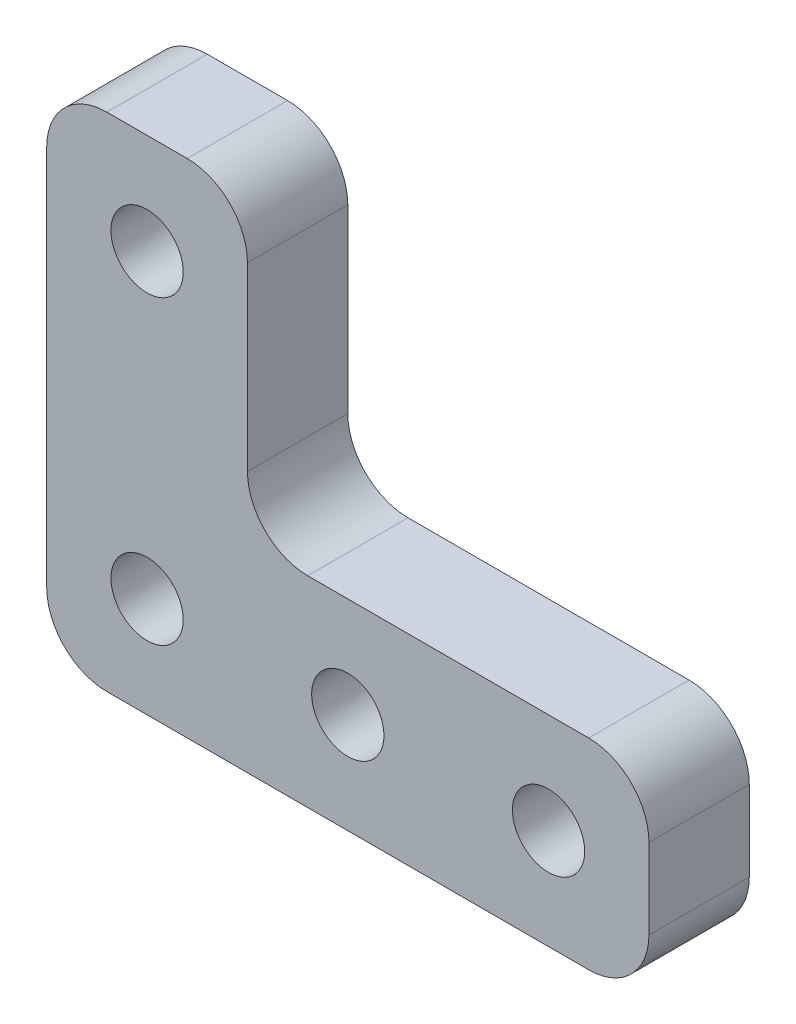
ISO-10303-21;
HEADER;
FILE_DESCRIPTION(('STEP AP214'),'2;1');
FILE_NAME('part.step','',(''),(''),'','','');
FILE_SCHEMA(('AUTOMOTIVE_DESIGN { 1 0 10303 214 1 1 1 1 }'));
ENDSEC;
DATA;
#1=APPLICATION_CONTEXT('core data for automotive mechanical design processes');
#2=APPLICATION_PROTOCOL_DEFINITION('international standard','automotive_design',2000,#1);
#3=PRODUCT_CONTEXT('',#1,'mechanical');
#4=PRODUCT('Part','Part','',(#3));
#5=PRODUCT_RELATED_PRODUCT_CATEGORY('part','',(#4));
#6=PRODUCT_DEFINITION_FORMATION('','',#4);
#7=PRODUCT_DEFINITION_CONTEXT('part definition',#1,'design');
#8=PRODUCT_DEFINITION('design','',#6,#7);
#9=PRODUCT_DEFINITION_SHAPE('','',#8);
#10=(LENGTH_UNIT() NAMED_UNIT(*) SI_UNIT(.MILLI.,.METRE.));
#11=(NAMED_UNIT(*) PLANE_ANGLE_UNIT() SI_UNIT($,.RADIAN.));
#12=(NAMED_UNIT(*) SI_UNIT($,.STERADIAN.) SOLID_ANGLE_UNIT());
#13=UNCERTAINTY_MEASURE_WITH_UNIT(LENGTH_MEASURE(1.E-05),#10,'distance_accuracy_value','');
#14=(GEOMETRIC_REPRESENTATION_CONTEXT(3) GLOBAL_UNCERTAINTY_ASSIGNED_CONTEXT((#13)) GLOBAL_UNIT_ASSIGNED_CONTEXT((#10,
#11,#12)) REPRESENTATION_CONTEXT('',''));
#15=CARTESIAN_POINT('',(0.,0.,0.));
#16=DIRECTION('',(0.,0.,1.));
#17=DIRECTION('',(1.,0.,0.));
#18=AXIS2_PLACEMENT_3D('',#15,#16,#17);
#19=CARTESIAN_POINT('',(0.,0.,6.35));
#20=DIRECTION('',(0.,0.,-1.));
#21=DIRECTION('',(-1.,0.,0.));
#22=AXIS2_PLACEMENT_3D('',#19,#20,#21);
#23=PLANE('',#22);
#24=DIRECTION('',(0.,1.,0.));
#25=VECTOR('',#24,1.);
#26=CARTESIAN_POINT('',(31.75,6.35,6.35));
#27=LINE('',#26,#25);
#28=CARTESIAN_POINT('',(31.75,-2.54,6.35));
#29=VERTEX_POINT('',#28);
#30=CARTESIAN_POINT('',(31.75,2.54,6.35));
#31=VERTEX_POINT('',#30);
#32=EDGE_CURVE('E228',#29,#31,#27,.T.);
#33=ORIENTED_EDGE('',*,*,#32,.T.);
#34=CARTESIAN_POINT('',(27.94,2.54,6.35));
#35=DIRECTION('',(0.,0.,-1.));
#36=DIRECTION('',(-1.,0.,0.));
#37=AXIS2_PLACEMENT_3D('',#34,#35,#36);
#38=CIRCLE('',#37,3.81);
#39=CARTESIAN_POINT('',(27.94,6.35,6.35));
#40=VERTEX_POINT('',#39);
#41=EDGE_CURVE('E200',#31,#40,#38,.F.);
#42=ORIENTED_EDGE('',*,*,#41,.T.);
#43=DIRECTION('',(-1.,0.,0.));
#44=VECTOR('',#43,1.);
#45=CARTESIAN_POINT('',(6.35,6.35,6.35));
#46=LINE('',#45,#44);
#47=CARTESIAN_POINT('',(10.16,6.35,6.35));
#48=VERTEX_POINT('',#47);
#49=EDGE_CURVE('E156',#40,#48,#46,.T.);
#50=ORIENTED_EDGE('',*,*,#49,.T.);
#51=CARTESIAN_POINT('',(10.16,10.16,6.35));
#52=DIRECTION('',(0.,0.,-1.));
#53=DIRECTION('',(-1.,0.,0.));
#54=AXIS2_PLACEMENT_3D('',#51,#52,#53);
#55=CIRCLE('',#54,3.81);
#56=CARTESIAN_POINT('',(6.35,10.16,6.35));
#57=VERTEX_POINT('',#56);
#58=EDGE_CURVE('E11',#48,#57,#55,.T.);
#59=ORIENTED_EDGE('',*,*,#58,.T.);
#60=DIRECTION('',(0.,1.,0.));
#61=VECTOR('',#60,1.);
#62=CARTESIAN_POINT('',(6.35,25.4,6.35));
#63=LINE('',#62,#61);
#64=CARTESIAN_POINT('',(6.35,21.59,6.35));
#65=VERTEX_POINT('',#64);
#66=EDGE_CURVE('E227',#57,#65,#63,.T.);
#67=ORIENTED_EDGE('',*,*,#66,.T.);
#68=CARTESIAN_POINT('',(2.54,21.59,6.35));
#69=DIRECTION('',(0.,0.,-1.));
#70=DIRECTION('',(-1.,0.,0.));
#71=AXIS2_PLACEMENT_3D('',#68,#69,#70);
#72=CIRCLE('',#71,3.81);
#73=CARTESIAN_POINT('',(2.54,25.4,6.35));
#74=VERTEX_POINT('',#73);
#75=EDGE_CURVE('E193',#65,#74,#72,.F.);
#76=ORIENTED_EDGE('',*,*,#75,.T.);
#77=DIRECTION('',(-1.,0.,0.));
#78=VECTOR('',#77,1.);
#79=CARTESIAN_POINT('',(-6.35,25.4,6.35));
#80=LINE('',#79,#78);
#81=CARTESIAN_POINT('',(-2.54,25.4,6.35));
#82=VERTEX_POINT('',#81);
#83=EDGE_CURVE('E232',#74,#82,#80,.T.);
#84=ORIENTED_EDGE('',*,*,#83,.T.);
#85=CARTESIAN_POINT('',(-2.54,21.59,6.35));
#86=DIRECTION('',(0.,0.,-1.));
#87=DIRECTION('',(-1.,0.,0.));
#88=AXIS2_PLACEMENT_3D('',#85,#86,#87);
#89=CIRCLE('',#88,3.81);
#90=CARTESIAN_POINT('',(-6.35,21.59,6.35));
#91=VERTEX_POINT('',#90);
#92=EDGE_CURVE('E66',#82,#91,#89,.F.);
#93=ORIENTED_EDGE('',*,*,#92,.T.);
#94=DIRECTION('',(0.,-1.,0.));
#95=VECTOR('',#94,1.);
#96=CARTESIAN_POINT('',(-6.35,-6.35,6.35));
#97=LINE('',#96,#95);
#98=CARTESIAN_POINT('',(-6.35,-2.54,6.35));
#99=VERTEX_POINT('',#98);
#100=EDGE_CURVE('E182',#91,#99,#97,.T.);
#101=ORIENTED_EDGE('',*,*,#100,.T.);
#102=CARTESIAN_POINT('',(-2.54,-2.54,6.35));
#103=DIRECTION('',(0.,0.,-1.));
#104=DIRECTION('',(-1.,0.,0.));
#105=AXIS2_PLACEMENT_3D('',#102,#103,#104);
#106=CIRCLE('',#105,3.81);
#107=CARTESIAN_POINT('',(-2.53999999999999,-6.35,6.35));
#108=VERTEX_POINT('',#107);
#109=EDGE_CURVE('E196',#99,#108,#106,.F.);
#110=ORIENTED_EDGE('',*,*,#109,.T.);
#111=DIRECTION('',(1.,0.,0.));
#112=VECTOR('',#111,1.);
#113=CARTESIAN_POINT('',(31.75,-6.35,6.35));
#114=LINE('',#113,#112);
#115=CARTESIAN_POINT('',(27.94,-6.35,6.35));
#116=VERTEX_POINT('',#115);
#117=EDGE_CURVE('E180',#108,#116,#114,.T.);
#118=ORIENTED_EDGE('',*,*,#117,.T.);
#119=CARTESIAN_POINT('',(27.94,-2.54,6.35));
#120=DIRECTION('',(0.,0.,-1.));
#121=DIRECTION('',(-1.,0.,0.));
#122=AXIS2_PLACEMENT_3D('',#119,#120,#121);
#123=CIRCLE('',#122,3.81);
#124=EDGE_CURVE('E198',#116,#29,#123,.F.);
#125=ORIENTED_EDGE('',*,*,#124,.T.);
#126=EDGE_LOOP('',(#33,#42,#50,#59,#67,#76,#84,#93,#101,#110,#118,#125));
#127=FACE_BOUND('',#126,.T.);
#128=CARTESIAN_POINT('',(0.,0.,6.35));
#129=DIRECTION('',(0.,0.,1.));
#130=DIRECTION('',(1.,0.,0.));
#131=AXIS2_PLACEMENT_3D('',#128,#129,#130);
#132=CIRCLE('',#131,2.286);
#133=CARTESIAN_POINT('',(2.286,0.,6.35));
#134=VERTEX_POINT('',#133);
#135=EDGE_CURVE('E240',#134,#134,#132,.T.);
#136=ORIENTED_EDGE('',*,*,#135,.F.);
#137=EDGE_LOOP('',(#136));
#138=FACE_BOUND('',#137,.T.);
#139=CARTESIAN_POINT('',(0.,19.05,6.35));
#140=DIRECTION('',(0.,0.,1.));
#141=DIRECTION('',(1.,0.,0.));
#142=AXIS2_PLACEMENT_3D('',#139,#140,#141);
#143=CIRCLE('',#142,2.286);
#144=CARTESIAN_POINT('',(2.286,19.05,6.35));
#145=VERTEX_POINT('',#144);
#146=EDGE_CURVE('E250',#145,#145,#143,.T.);
#147=ORIENTED_EDGE('',*,*,#146,.F.);
#148=EDGE_LOOP('',(#147));
#149=FACE_BOUND('',#148,.T.);
#150=CARTESIAN_POINT('',(12.7,0.,6.35));
#151=DIRECTION('',(0.,0.,1.));
#152=DIRECTION('',(1.,0.,0.));
#153=AXIS2_PLACEMENT_3D('',#150,#151,#152);
#154=CIRCLE('',#153,2.286);
#155=CARTESIAN_POINT('',(14.986,0.,6.35));
#156=VERTEX_POINT('',#155);
#157=EDGE_CURVE('E221',#156,#156,#154,.T.);
#158=ORIENTED_EDGE('',*,*,#157,.F.);
#159=EDGE_LOOP('',(#158));
#160=FACE_BOUND('',#159,.T.);
#161=CARTESIAN_POINT('',(25.4,0.,6.35));
#162=DIRECTION('',(0.,0.,1.));
#163=DIRECTION('',(1.,0.,0.));
#164=AXIS2_PLACEMENT_3D('',#161,#162,#163);
#165=CIRCLE('',#164,2.286);
#166=CARTESIAN_POINT('',(27.686,0.,6.35));
#167=VERTEX_POINT('',#166);
#168=EDGE_CURVE('E480',#167,#167,#165,.T.);
#169=ORIENTED_EDGE('',*,*,#168,.F.);
#170=EDGE_LOOP('',(#169));
#171=FACE_BOUND('',#170,.T.);
#172=ADVANCED_FACE('F43',(#127,#138,#149,#160,#171),#23,.F.);
#173=CARTESIAN_POINT('',(0.,0.,0.));
#174=DIRECTION('',(0.,0.,-1.));
#175=DIRECTION('',(-1.,0.,0.));
#176=AXIS2_PLACEMENT_3D('',#173,#174,#175);
#177=PLANE('',#176);
#178=CARTESIAN_POINT('',(12.7,0.,0.));
#179=DIRECTION('',(0.,0.,1.));
#180=DIRECTION('',(1.,0.,0.));
#181=AXIS2_PLACEMENT_3D('',#178,#179,#180);
#182=CIRCLE('',#181,2.286);
#183=CARTESIAN_POINT('',(14.986,0.,0.));
#184=VERTEX_POINT('',#183);
#185=EDGE_CURVE('E225',#184,#184,#182,.T.);
#186=ORIENTED_EDGE('',*,*,#185,.T.);
#187=EDGE_LOOP('',(#186));
#188=FACE_BOUND('',#187,.T.);
#189=CARTESIAN_POINT('',(0.,0.,0.));
#190=DIRECTION('',(0.,0.,1.));
#191=DIRECTION('',(1.,0.,0.));
#192=AXIS2_PLACEMENT_3D('',#189,#190,#191);
#193=CIRCLE('',#192,2.286);
#194=CARTESIAN_POINT('',(2.286,0.,0.));
#195=VERTEX_POINT('',#194);
#196=EDGE_CURVE('E245',#195,#195,#193,.T.);
#197=ORIENTED_EDGE('',*,*,#196,.T.);
#198=EDGE_LOOP('',(#197));
#199=FACE_BOUND('',#198,.T.);
#200=DIRECTION('',(-1.,0.,0.));
#201=VECTOR('',#200,1.);
#202=CARTESIAN_POINT('',(6.35,6.35,0.));
#203=LINE('',#202,#201);
#204=CARTESIAN_POINT('',(27.94,6.35,0.));
#205=VERTEX_POINT('',#204);
#206=CARTESIAN_POINT('',(10.16,6.35,0.));
#207=VERTEX_POINT('',#206);
#208=EDGE_CURVE('E153',#205,#207,#203,.T.);
#209=ORIENTED_EDGE('',*,*,#208,.F.);
#210=CARTESIAN_POINT('',(27.94,2.54,0.));
#211=DIRECTION('',(0.,0.,-1.));
#212=DIRECTION('',(-1.,0.,0.));
#213=AXIS2_PLACEMENT_3D('',#210,#211,#212);
#214=CIRCLE('',#213,3.81);
#215=CARTESIAN_POINT('',(31.75,2.54,0.));
#216=VERTEX_POINT('',#215);
#217=EDGE_CURVE('E136',#205,#216,#214,.T.);
#218=ORIENTED_EDGE('',*,*,#217,.T.);
#219=DIRECTION('',(0.,1.,0.));
#220=VECTOR('',#219,1.);
#221=CARTESIAN_POINT('',(31.75,6.35,0.));
#222=LINE('',#221,#220);
#223=CARTESIAN_POINT('',(31.75,-2.54,0.));
#224=VERTEX_POINT('',#223);
#225=EDGE_CURVE('E165',#224,#216,#222,.T.);
#226=ORIENTED_EDGE('',*,*,#225,.F.);
#227=CARTESIAN_POINT('',(27.94,-2.54,0.));
#228=DIRECTION('',(0.,0.,-1.));
#229=DIRECTION('',(-1.,0.,0.));
#230=AXIS2_PLACEMENT_3D('',#227,#228,#229);
#231=CIRCLE('',#230,3.81);
#232=CARTESIAN_POINT('',(27.94,-6.35,0.));
#233=VERTEX_POINT('',#232);
#234=EDGE_CURVE('E147',#224,#233,#231,.T.);
#235=ORIENTED_EDGE('',*,*,#234,.T.);
#236=DIRECTION('',(1.,0.,0.));
#237=VECTOR('',#236,1.);
#238=CARTESIAN_POINT('',(31.75,-6.35,0.));
#239=LINE('',#238,#237);
#240=CARTESIAN_POINT('',(-2.53999999999999,-6.35,0.));
#241=VERTEX_POINT('',#240);
#242=EDGE_CURVE('E172',#241,#233,#239,.T.);
#243=ORIENTED_EDGE('',*,*,#242,.F.);
#244=CARTESIAN_POINT('',(-2.54,-2.54,0.));
#245=DIRECTION('',(0.,0.,-1.));
#246=DIRECTION('',(-1.,0.,0.));
#247=AXIS2_PLACEMENT_3D('',#244,#245,#246);
#248=CIRCLE('',#247,3.81);
#249=CARTESIAN_POINT('',(-6.35,-2.54,0.));
#250=VERTEX_POINT('',#249);
#251=EDGE_CURVE('E187',#241,#250,#248,.T.);
#252=ORIENTED_EDGE('',*,*,#251,.T.);
#253=DIRECTION('',(0.,-1.,0.));
#254=VECTOR('',#253,1.);
#255=CARTESIAN_POINT('',(-6.35,-6.35,0.));
#256=LINE('',#255,#254);
#257=CARTESIAN_POINT('',(-6.35,21.59,0.));
#258=VERTEX_POINT('',#257);
#259=EDGE_CURVE('E178',#258,#250,#256,.T.);
#260=ORIENTED_EDGE('',*,*,#259,.F.);
#261=CARTESIAN_POINT('',(-2.54,21.59,0.));
#262=DIRECTION('',(0.,0.,-1.));
#263=DIRECTION('',(-1.,0.,0.));
#264=AXIS2_PLACEMENT_3D('',#261,#262,#263);
#265=CIRCLE('',#264,3.81);
#266=CARTESIAN_POINT('',(-2.54,25.4,0.));
#267=VERTEX_POINT('',#266);
#268=EDGE_CURVE('E185',#258,#267,#265,.T.);
#269=ORIENTED_EDGE('',*,*,#268,.T.);
#270=DIRECTION('',(-1.,0.,0.));
#271=VECTOR('',#270,1.);
#272=CARTESIAN_POINT('',(-6.35,25.4,0.));
#273=LINE('',#272,#271);
#274=CARTESIAN_POINT('',(2.54,25.4,0.));
#275=VERTEX_POINT('',#274);
#276=EDGE_CURVE('E170',#275,#267,#273,.T.);
#277=ORIENTED_EDGE('',*,*,#276,.F.);
#278=CARTESIAN_POINT('',(2.54,21.59,0.));
#279=DIRECTION('',(0.,0.,-1.));
#280=DIRECTION('',(-1.,0.,0.));
#281=AXIS2_PLACEMENT_3D('',#278,#279,#280);
#282=CIRCLE('',#281,3.81);
#283=CARTESIAN_POINT('',(6.35,21.59,0.));
#284=VERTEX_POINT('',#283);
#285=EDGE_CURVE('E157',#275,#284,#282,.T.);
#286=ORIENTED_EDGE('',*,*,#285,.T.);
#287=DIRECTION('',(0.,1.,0.));
#288=VECTOR('',#287,1.);
#289=CARTESIAN_POINT('',(6.35,25.4,0.));
#290=LINE('',#289,#288);
#291=CARTESIAN_POINT('',(6.35,10.16,0.));
#292=VERTEX_POINT('',#291);
#293=EDGE_CURVE('E164',#292,#284,#290,.T.);
#294=ORIENTED_EDGE('',*,*,#293,.F.);
#295=CARTESIAN_POINT('',(10.16,10.16,0.));
#296=DIRECTION('',(0.,0.,-1.));
#297=DIRECTION('',(-1.,0.,0.));
#298=AXIS2_PLACEMENT_3D('',#295,#296,#297);
#299=CIRCLE('',#298,3.81);
#300=EDGE_CURVE('E52',#292,#207,#299,.F.);
#301=ORIENTED_EDGE('',*,*,#300,.T.);
#302=EDGE_LOOP('',(#209,#218,#226,#235,#243,#252,#260,#269,#277,#286,#294,#301));
#303=FACE_BOUND('',#302,.T.);
#304=CARTESIAN_POINT('',(0.,19.05,0.));
#305=DIRECTION('',(0.,0.,1.));
#306=DIRECTION('',(1.,0.,0.));
#307=AXIS2_PLACEMENT_3D('',#304,#305,#306);
#308=CIRCLE('',#307,2.286);
#309=CARTESIAN_POINT('',(2.286,19.05,0.));
#310=VERTEX_POINT('',#309);
#311=EDGE_CURVE('E224',#310,#310,#308,.T.);
#312=ORIENTED_EDGE('',*,*,#311,.T.);
#313=EDGE_LOOP('',(#312));
#314=FACE_BOUND('',#313,.T.);
#315=CARTESIAN_POINT('',(25.4,0.,0.));
#316=DIRECTION('',(0.,0.,1.));
#317=DIRECTION('',(1.,0.,0.));
#318=AXIS2_PLACEMENT_3D('',#315,#316,#317);
#319=CIRCLE('',#318,2.286);
#320=CARTESIAN_POINT('',(27.686,0.,0.));
#321=VERTEX_POINT('',#320);
#322=EDGE_CURVE('E483',#321,#321,#319,.T.);
#323=ORIENTED_EDGE('',*,*,#322,.T.);
#324=EDGE_LOOP('',(#323));
#325=FACE_BOUND('',#324,.T.);
#326=ADVANCED_FACE('F160',(#188,#199,#303,#314,#325),#177,.T.);
#327=CARTESIAN_POINT('',(31.75,-6.35,6.35));
#328=DIRECTION('',(0.,1.,0.));
#329=DIRECTION('',(-1.,0.,0.));
#330=AXIS2_PLACEMENT_3D('',#327,#328,#329);
#331=PLANE('',#330);
#332=ORIENTED_EDGE('',*,*,#242,.T.);
#333=DIRECTION('',(0.,0.,-1.));
#334=VECTOR('',#333,1.);
#335=CARTESIAN_POINT('',(27.94,-6.35,6.35));
#336=LINE('',#335,#334);
#337=EDGE_CURVE('E205',#233,#116,#336,.F.);
#338=ORIENTED_EDGE('',*,*,#337,.T.);
#339=ORIENTED_EDGE('',*,*,#117,.F.);
#340=DIRECTION('',(0.,0.,-1.));
#341=VECTOR('',#340,1.);
#342=CARTESIAN_POINT('',(-2.54,-6.35,6.35));
#343=LINE('',#342,#341);
#344=EDGE_CURVE('E202',#108,#241,#343,.T.);
#345=ORIENTED_EDGE('',*,*,#344,.T.);
#346=EDGE_LOOP('',(#332,#338,#339,#345));
#347=FACE_BOUND('',#346,.T.);
#348=ADVANCED_FACE('F271',(#347),#331,.F.);
#349=CARTESIAN_POINT('',(31.75,6.35,6.35));
#350=DIRECTION('',(-1.,0.,0.));
#351=DIRECTION('',(0.,0.,1.));
#352=AXIS2_PLACEMENT_3D('',#349,#350,#351);
#353=PLANE('',#352);
#354=ORIENTED_EDGE('',*,*,#225,.T.);
#355=DIRECTION('',(0.,0.,-1.));
#356=VECTOR('',#355,1.);
#357=CARTESIAN_POINT('',(31.75,2.54,6.35));
#358=LINE('',#357,#356);
#359=EDGE_CURVE('E141',#216,#31,#358,.F.);
#360=ORIENTED_EDGE('',*,*,#359,.T.);
#361=ORIENTED_EDGE('',*,*,#32,.F.);
#362=DIRECTION('',(0.,0.,-1.));
#363=VECTOR('',#362,1.);
#364=CARTESIAN_POINT('',(31.75,-2.54,6.35));
#365=LINE('',#364,#363);
#366=EDGE_CURVE('E146',#29,#224,#365,.T.);
#367=ORIENTED_EDGE('',*,*,#366,.T.);
#368=EDGE_LOOP('',(#354,#360,#361,#367));
#369=FACE_BOUND('',#368,.T.);
#370=ADVANCED_FACE('F265',(#369),#353,.F.);
#371=CARTESIAN_POINT('',(6.35,6.35,6.35));
#372=DIRECTION('',(0.,-1.,0.));
#373=DIRECTION('',(1.,0.,0.));
#374=AXIS2_PLACEMENT_3D('',#371,#372,#373);
#375=PLANE('',#374);
#376=ORIENTED_EDGE('',*,*,#49,.F.);
#377=DIRECTION('',(0.,0.,-1.));
#378=VECTOR('',#377,1.);
#379=CARTESIAN_POINT('',(27.94,6.35,6.35));
#380=LINE('',#379,#378);
#381=EDGE_CURVE('E140',#40,#205,#380,.T.);
#382=ORIENTED_EDGE('',*,*,#381,.T.);
#383=ORIENTED_EDGE('',*,*,#208,.T.);
#384=DIRECTION('',(0.,0.,-1.));
#385=VECTOR('',#384,1.);
#386=CARTESIAN_POINT('',(10.16,6.35,6.35));
#387=LINE('',#386,#385);
#388=EDGE_CURVE('E158',#207,#48,#387,.F.);
#389=ORIENTED_EDGE('',*,*,#388,.T.);
#390=EDGE_LOOP('',(#376,#382,#383,#389));
#391=FACE_BOUND('',#390,.T.);
#392=ADVANCED_FACE('F152',(#391),#375,.F.);
#393=CARTESIAN_POINT('',(6.35,25.4,6.35));
#394=DIRECTION('',(-1.,0.,0.));
#395=DIRECTION('',(0.,-1.,0.));
#396=AXIS2_PLACEMENT_3D('',#393,#394,#395);
#397=PLANE('',#396);
#398=ORIENTED_EDGE('',*,*,#293,.T.);
#399=DIRECTION('',(0.,0.,-1.));
#400=VECTOR('',#399,1.);
#401=CARTESIAN_POINT('',(6.35,21.59,6.35));
#402=LINE('',#401,#400);
#403=EDGE_CURVE('E219',#284,#65,#402,.F.);
#404=ORIENTED_EDGE('',*,*,#403,.T.);
#405=ORIENTED_EDGE('',*,*,#66,.F.);
#406=DIRECTION('',(0.,0.,-1.));
#407=VECTOR('',#406,1.);
#408=CARTESIAN_POINT('',(6.35,10.16,0.));
#409=LINE('',#408,#407);
#410=EDGE_CURVE('E216',#57,#292,#409,.T.);
#411=ORIENTED_EDGE('',*,*,#410,.T.);
#412=EDGE_LOOP('',(#398,#404,#405,#411));
#413=FACE_BOUND('',#412,.T.);
#414=ADVANCED_FACE('F295',(#413),#397,.F.);
#415=CARTESIAN_POINT('',(-6.35,25.4,6.35));
#416=DIRECTION('',(0.,-1.,0.));
#417=DIRECTION('',(1.,0.,0.));
#418=AXIS2_PLACEMENT_3D('',#415,#416,#417);
#419=PLANE('',#418);
#420=ORIENTED_EDGE('',*,*,#276,.T.);
#421=DIRECTION('',(0.,0.,-1.));
#422=VECTOR('',#421,1.);
#423=CARTESIAN_POINT('',(-2.54,25.4,6.35));
#424=LINE('',#423,#422);
#425=EDGE_CURVE('E214',#267,#82,#424,.F.);
#426=ORIENTED_EDGE('',*,*,#425,.T.);
#427=ORIENTED_EDGE('',*,*,#83,.F.);
#428=DIRECTION('',(0.,0.,-1.));
#429=VECTOR('',#428,1.);
#430=CARTESIAN_POINT('',(2.54,25.4,6.35));
#431=LINE('',#430,#429);
#432=EDGE_CURVE('E211',#74,#275,#431,.T.);
#433=ORIENTED_EDGE('',*,*,#432,.T.);
#434=EDGE_LOOP('',(#420,#426,#427,#433));
#435=FACE_BOUND('',#434,.T.);
#436=ADVANCED_FACE('F292',(#435),#419,.F.);
#437=CARTESIAN_POINT('',(-6.35,-6.35,6.35));
#438=DIRECTION('',(1.,0.,0.));
#439=DIRECTION('',(0.,1.,0.));
#440=AXIS2_PLACEMENT_3D('',#437,#438,#439);
#441=PLANE('',#440);
#442=ORIENTED_EDGE('',*,*,#259,.T.);
#443=DIRECTION('',(0.,0.,-1.));
#444=VECTOR('',#443,1.);
#445=CARTESIAN_POINT('',(-6.35,-2.54,6.35));
#446=LINE('',#445,#444);
#447=EDGE_CURVE('E59',#250,#99,#446,.F.);
#448=ORIENTED_EDGE('',*,*,#447,.T.);
#449=ORIENTED_EDGE('',*,*,#100,.F.);
#450=DIRECTION('',(0.,0.,-1.));
#451=VECTOR('',#450,1.);
#452=CARTESIAN_POINT('',(-6.35,21.59,6.35));
#453=LINE('',#452,#451);
#454=EDGE_CURVE('E207',#91,#258,#453,.T.);
#455=ORIENTED_EDGE('',*,*,#454,.T.);
#456=EDGE_LOOP('',(#442,#448,#449,#455));
#457=FACE_BOUND('',#456,.T.);
#458=ADVANCED_FACE('F268',(#457),#441,.F.);
#459=CARTESIAN_POINT('',(0.,0.,6.35));
#460=DIRECTION('',(0.,0.,-1.));
#461=DIRECTION('',(-1.,0.,0.));
#462=AXIS2_PLACEMENT_3D('',#459,#460,#461);
#463=CYLINDRICAL_SURFACE('',#462,2.286);
#464=ORIENTED_EDGE('',*,*,#135,.T.);
#465=EDGE_LOOP('',(#464));
#466=FACE_BOUND('',#465,.T.);
#467=ORIENTED_EDGE('',*,*,#196,.F.);
#468=EDGE_LOOP('',(#467));
#469=FACE_BOUND('',#468,.T.);
#470=ADVANCED_FACE('F287',(#466,#469),#463,.F.);
#471=CARTESIAN_POINT('',(0.,19.05,6.35));
#472=DIRECTION('',(0.,0.,-1.));
#473=DIRECTION('',(-1.,0.,0.));
#474=AXIS2_PLACEMENT_3D('',#471,#472,#473);
#475=CYLINDRICAL_SURFACE('',#474,2.286);
#476=ORIENTED_EDGE('',*,*,#146,.T.);
#477=EDGE_LOOP('',(#476));
#478=FACE_BOUND('',#477,.T.);
#479=ORIENTED_EDGE('',*,*,#311,.F.);
#480=EDGE_LOOP('',(#479));
#481=FACE_BOUND('',#480,.T.);
#482=ADVANCED_FACE('F324',(#478,#481),#475,.F.);
#483=CARTESIAN_POINT('',(12.7,0.,6.35));
#484=DIRECTION('',(0.,0.,-1.));
#485=DIRECTION('',(-1.,0.,0.));
#486=AXIS2_PLACEMENT_3D('',#483,#484,#485);
#487=CYLINDRICAL_SURFACE('',#486,2.286);
#488=ORIENTED_EDGE('',*,*,#157,.T.);
#489=EDGE_LOOP('',(#488));
#490=FACE_BOUND('',#489,.T.);
#491=ORIENTED_EDGE('',*,*,#185,.F.);
#492=EDGE_LOOP('',(#491));
#493=FACE_BOUND('',#492,.T.);
#494=ADVANCED_FACE('F330',(#490,#493),#487,.F.);
#495=CARTESIAN_POINT('',(25.4,0.,6.35));
#496=DIRECTION('',(0.,0.,-1.));
#497=DIRECTION('',(-1.,0.,0.));
#498=AXIS2_PLACEMENT_3D('',#495,#496,#497);
#499=CYLINDRICAL_SURFACE('',#498,2.286);
#500=ORIENTED_EDGE('',*,*,#168,.T.);
#501=EDGE_LOOP('',(#500));
#502=FACE_BOUND('',#501,.T.);
#503=ORIENTED_EDGE('',*,*,#322,.F.);
#504=EDGE_LOOP('',(#503));
#505=FACE_BOUND('',#504,.T.);
#506=ADVANCED_FACE('F337',(#502,#505),#499,.F.);
#507=CARTESIAN_POINT('',(27.94,2.54,6.35));
#508=DIRECTION('',(0.,0.,-1.));
#509=DIRECTION('',(-1.,0.,0.));
#510=AXIS2_PLACEMENT_3D('',#507,#508,#509);
#511=CYLINDRICAL_SURFACE('',#510,3.81);
#512=ORIENTED_EDGE('',*,*,#41,.F.);
#513=ORIENTED_EDGE('',*,*,#359,.F.);
#514=ORIENTED_EDGE('',*,*,#217,.F.);
#515=ORIENTED_EDGE('',*,*,#381,.F.);
#516=EDGE_LOOP('',(#512,#513,#514,#515));
#517=FACE_BOUND('',#516,.T.);
#518=ADVANCED_FACE('F139',(#517),#511,.T.);
#519=CARTESIAN_POINT('',(27.94,-2.54,6.35));
#520=DIRECTION('',(0.,0.,-1.));
#521=DIRECTION('',(-1.,0.,0.));
#522=AXIS2_PLACEMENT_3D('',#519,#520,#521);
#523=CYLINDRICAL_SURFACE('',#522,3.81);
#524=ORIENTED_EDGE('',*,*,#124,.F.);
#525=ORIENTED_EDGE('',*,*,#337,.F.);
#526=ORIENTED_EDGE('',*,*,#234,.F.);
#527=ORIENTED_EDGE('',*,*,#366,.F.);
#528=EDGE_LOOP('',(#524,#525,#526,#527));
#529=FACE_BOUND('',#528,.T.);
#530=ADVANCED_FACE('F263',(#529),#523,.T.);
#531=CARTESIAN_POINT('',(-2.54,-2.54,6.35));
#532=DIRECTION('',(0.,0.,-1.));
#533=DIRECTION('',(-1.,0.,0.));
#534=AXIS2_PLACEMENT_3D('',#531,#532,#533);
#535=CYLINDRICAL_SURFACE('',#534,3.81);
#536=ORIENTED_EDGE('',*,*,#109,.F.);
#537=ORIENTED_EDGE('',*,*,#447,.F.);
#538=ORIENTED_EDGE('',*,*,#251,.F.);
#539=ORIENTED_EDGE('',*,*,#344,.F.);
#540=EDGE_LOOP('',(#536,#537,#538,#539));
#541=FACE_BOUND('',#540,.T.);
#542=ADVANCED_FACE('F270',(#541),#535,.T.);
#543=CARTESIAN_POINT('',(-2.54,21.59,6.35));
#544=DIRECTION('',(0.,0.,-1.));
#545=DIRECTION('',(-1.,0.,0.));
#546=AXIS2_PLACEMENT_3D('',#543,#544,#545);
#547=CYLINDRICAL_SURFACE('',#546,3.81);
#548=ORIENTED_EDGE('',*,*,#92,.F.);
#549=ORIENTED_EDGE('',*,*,#425,.F.);
#550=ORIENTED_EDGE('',*,*,#268,.F.);
#551=ORIENTED_EDGE('',*,*,#454,.F.);
#552=EDGE_LOOP('',(#548,#549,#550,#551));
#553=FACE_BOUND('',#552,.T.);
#554=ADVANCED_FACE('F363',(#553),#547,.T.);
#555=CARTESIAN_POINT('',(2.54,21.59,6.35));
#556=DIRECTION('',(0.,0.,-1.));
#557=DIRECTION('',(-1.,0.,0.));
#558=AXIS2_PLACEMENT_3D('',#555,#556,#557);
#559=CYLINDRICAL_SURFACE('',#558,3.81);
#560=ORIENTED_EDGE('',*,*,#75,.F.);
#561=ORIENTED_EDGE('',*,*,#403,.F.);
#562=ORIENTED_EDGE('',*,*,#285,.F.);
#563=ORIENTED_EDGE('',*,*,#432,.F.);
#564=EDGE_LOOP('',(#560,#561,#562,#563));
#565=FACE_BOUND('',#564,.T.);
#566=ADVANCED_FACE('F370',(#565),#559,.T.);
#567=CARTESIAN_POINT('',(10.16,10.16,6.35));
#568=DIRECTION('',(0.,0.,1.));
#569=DIRECTION('',(1.,0.,0.));
#570=AXIS2_PLACEMENT_3D('',#567,#568,#569);
#571=CYLINDRICAL_SURFACE('',#570,3.81);
#572=ORIENTED_EDGE('',*,*,#58,.F.);
#573=ORIENTED_EDGE('',*,*,#388,.F.);
#574=ORIENTED_EDGE('',*,*,#300,.F.);
#575=ORIENTED_EDGE('',*,*,#410,.F.);
#576=EDGE_LOOP('',(#572,#573,#574,#575));
#577=FACE_BOUND('',#576,.T.);
#578=ADVANCED_FACE('F45',(#577),#571,.F.);
#579=CLOSED_SHELL('',(#172,#326,#348,#370,#392,#414,#436,#458,#470,#482,#494,#506,#518,#530,
#542,#554,#566,#578));
#580=MANIFOLD_SOLID_BREP('B2',#579);
#581=ADVANCED_BREP_SHAPE_REPRESENTATION('',(#18,#580),#14);
#582=SHAPE_DEFINITION_REPRESENTATION(#9,#581);
ENDSEC;
END-ISO-10303-21;
